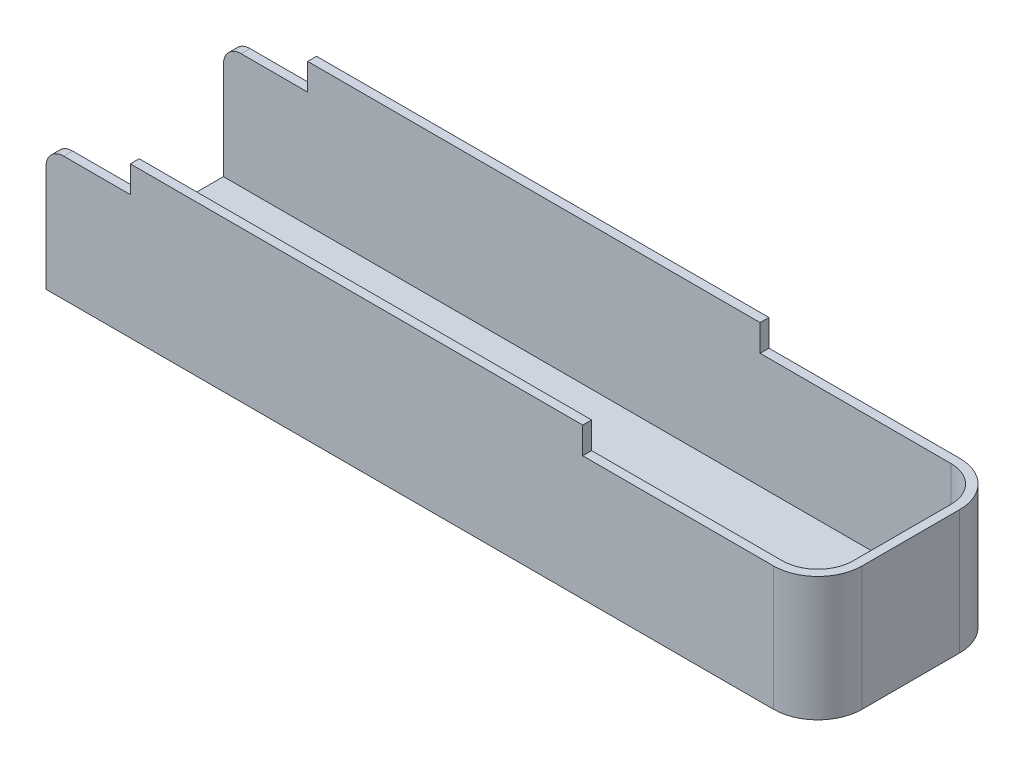
ISO-10303-21;
HEADER;
FILE_DESCRIPTION(('STEP AP214'),'2;1');
FILE_NAME('part.step','',(''),(''),'','','');
FILE_SCHEMA(('AUTOMOTIVE_DESIGN { 1 0 10303 214 1 1 1 1 }'));
ENDSEC;
DATA;
#1=APPLICATION_CONTEXT('core data for automotive mechanical design processes');
#2=APPLICATION_PROTOCOL_DEFINITION('international standard','automotive_design',2000,#1);
#3=PRODUCT_CONTEXT('',#1,'mechanical');
#4=PRODUCT('Part','Part','',(#3));
#5=PRODUCT_RELATED_PRODUCT_CATEGORY('part','',(#4));
#6=PRODUCT_DEFINITION_FORMATION('','',#4);
#7=PRODUCT_DEFINITION_CONTEXT('part definition',#1,'design');
#8=PRODUCT_DEFINITION('design','',#6,#7);
#9=PRODUCT_DEFINITION_SHAPE('','',#8);
#10=(LENGTH_UNIT() NAMED_UNIT(*) SI_UNIT(.MILLI.,.METRE.));
#11=(NAMED_UNIT(*) PLANE_ANGLE_UNIT() SI_UNIT($,.RADIAN.));
#12=(NAMED_UNIT(*) SI_UNIT($,.STERADIAN.) SOLID_ANGLE_UNIT());
#13=UNCERTAINTY_MEASURE_WITH_UNIT(LENGTH_MEASURE(1.E-05),#10,'distance_accuracy_value','');
#14=(GEOMETRIC_REPRESENTATION_CONTEXT(3) GLOBAL_UNCERTAINTY_ASSIGNED_CONTEXT((#13)) GLOBAL_UNIT_ASSIGNED_CONTEXT((#10,
#11,#12)) REPRESENTATION_CONTEXT('',''));
#15=CARTESIAN_POINT('',(0.,0.,0.));
#16=DIRECTION('',(0.,0.,1.));
#17=DIRECTION('',(1.,0.,0.));
#18=AXIS2_PLACEMENT_3D('',#15,#16,#17);
#19=CARTESIAN_POINT('',(38.4999999999949,17.,-5.50000000000137));
#20=DIRECTION('',(0.,1.,0.));
#21=DIRECTION('',(0.,0.,1.));
#22=AXIS2_PLACEMENT_3D('',#19,#20,#21);
#23=PLANE('',#22);
#24=DIRECTION('',(0.,0.,1.));
#25=VECTOR('',#24,1.);
#26=CARTESIAN_POINT('',(-33.9999999999959,16.999999999998,-15.4999999999986));
#27=LINE('',#26,#25);
#28=CARTESIAN_POINT('',(-33.9999999999959,16.999999999998,-10.5000000000014));
#29=VERTEX_POINT('',#28);
#30=CARTESIAN_POINT('',(-33.9999999999959,16.999999999998,-9.50000000000136));
#31=VERTEX_POINT('',#30);
#32=EDGE_CURVE('E205',#29,#31,#27,.T.);
#33=ORIENTED_EDGE('',*,*,#32,.T.);
#34=DIRECTION('',(-1.,0.,0.));
#35=VECTOR('',#34,1.);
#36=CARTESIAN_POINT('',(38.4999999999949,17.,-9.50000000000136));
#37=LINE('',#36,#35);
#38=CARTESIAN_POINT('',(16.999999999998,16.999999999998,-9.50000000000136));
#39=VERTEX_POINT('',#38);
#40=EDGE_CURVE('E272',#39,#31,#37,.T.);
#41=ORIENTED_EDGE('',*,*,#40,.F.);
#42=DIRECTION('',(0.,0.,1.));
#43=VECTOR('',#42,1.);
#44=CARTESIAN_POINT('',(16.999999999998,16.999999999998,-15.4999999999986));
#45=LINE('',#44,#43);
#46=CARTESIAN_POINT('',(16.999999999998,16.999999999998,-10.5000000000014));
#47=VERTEX_POINT('',#46);
#48=EDGE_CURVE('E225',#47,#39,#45,.T.);
#49=ORIENTED_EDGE('',*,*,#48,.F.);
#50=DIRECTION('',(-1.,0.,0.));
#51=VECTOR('',#50,1.);
#52=CARTESIAN_POINT('',(38.4999999999949,17.,-10.5000000000014));
#53=LINE('',#52,#51);
#54=EDGE_CURVE('E286',#47,#29,#53,.T.);
#55=ORIENTED_EDGE('',*,*,#54,.T.);
#56=EDGE_LOOP('',(#33,#41,#49,#55));
#57=FACE_BOUND('',#56,.T.);
#58=ADVANCED_FACE('F33',(#57),#23,.T.);
#59=CARTESIAN_POINT('',(-33.9999999999959,16.999999999998,9.50000000000136));
#60=VERTEX_POINT('',#59);
#61=CARTESIAN_POINT('',(-33.9999999999959,16.999999999998,10.5000000000014));
#62=VERTEX_POINT('',#61);
#63=EDGE_CURVE('E204',#60,#62,#27,.T.);
#64=ORIENTED_EDGE('',*,*,#63,.T.);
#65=DIRECTION('',(1.,0.,0.));
#66=VECTOR('',#65,1.);
#67=CARTESIAN_POINT('',(-43.4999999999949,17.,10.5000000000014));
#68=LINE('',#67,#66);
#69=CARTESIAN_POINT('',(16.999999999998,16.999999999998,10.5000000000014));
#70=VERTEX_POINT('',#69);
#71=EDGE_CURVE('E201',#62,#70,#68,.T.);
#72=ORIENTED_EDGE('',*,*,#71,.T.);
#73=CARTESIAN_POINT('',(16.999999999998,16.999999999998,9.50000000000136));
#74=VERTEX_POINT('',#73);
#75=EDGE_CURVE('E222',#74,#70,#45,.T.);
#76=ORIENTED_EDGE('',*,*,#75,.F.);
#77=DIRECTION('',(1.,0.,0.));
#78=VECTOR('',#77,1.);
#79=CARTESIAN_POINT('',(-42.4999999999949,17.,9.50000000000136));
#80=LINE('',#79,#78);
#81=EDGE_CURVE('E275',#60,#74,#80,.T.);
#82=ORIENTED_EDGE('',*,*,#81,.F.);
#83=EDGE_LOOP('',(#64,#72,#76,#82));
#84=FACE_BOUND('',#83,.T.);
#85=ADVANCED_FACE('F354',(#84),#23,.T.);
#86=CARTESIAN_POINT('',(38.4999999999949,0.,-5.50000000000137));
#87=DIRECTION('',(0.,1.,0.));
#88=DIRECTION('',(0.,0.,1.));
#89=AXIS2_PLACEMENT_3D('',#86,#87,#88);
#90=PLANE('',#89);
#91=CARTESIAN_POINT('',(38.4999999999949,0.,-5.50000000000137));
#92=DIRECTION('',(0.,1.,0.));
#93=DIRECTION('',(0.,0.,1.));
#94=AXIS2_PLACEMENT_3D('',#91,#92,#93);
#95=CIRCLE('',#94,5.);
#96=CARTESIAN_POINT('',(43.4999999999949,0.,-5.50000000000134));
#97=VERTEX_POINT('',#96);
#98=CARTESIAN_POINT('',(38.4999999999949,0.,-10.5000000000014));
#99=VERTEX_POINT('',#98);
#100=EDGE_CURVE('E285',#97,#99,#95,.T.);
#101=ORIENTED_EDGE('',*,*,#100,.F.);
#102=DIRECTION('',(0.,0.,-1.));
#103=VECTOR('',#102,1.);
#104=CARTESIAN_POINT('',(43.4999999999949,0.,5.50000000000133));
#105=LINE('',#104,#103);
#106=CARTESIAN_POINT('',(43.4999999999949,0.,5.50000000000133));
#107=VERTEX_POINT('',#106);
#108=EDGE_CURVE('E289',#107,#97,#105,.T.);
#109=ORIENTED_EDGE('',*,*,#108,.F.);
#110=CARTESIAN_POINT('',(38.4999999999949,0.,5.50000000000137));
#111=DIRECTION('',(0.,1.,0.));
#112=DIRECTION('',(0.,0.,1.));
#113=AXIS2_PLACEMENT_3D('',#110,#111,#112);
#114=CIRCLE('',#113,5.);
#115=CARTESIAN_POINT('',(38.4999999999949,0.,10.5000000000014));
#116=VERTEX_POINT('',#115);
#117=EDGE_CURVE('E303',#116,#107,#114,.T.);
#118=ORIENTED_EDGE('',*,*,#117,.F.);
#119=DIRECTION('',(1.,0.,0.));
#120=VECTOR('',#119,1.);
#121=CARTESIAN_POINT('',(-43.4999999999949,0.,10.5000000000014));
#122=LINE('',#121,#120);
#123=CARTESIAN_POINT('',(-43.4999999999949,0.,10.5000000000014));
#124=VERTEX_POINT('',#123);
#125=EDGE_CURVE('E300',#124,#116,#122,.T.);
#126=ORIENTED_EDGE('',*,*,#125,.F.);
#127=DIRECTION('',(0.,0.,1.));
#128=VECTOR('',#127,1.);
#129=CARTESIAN_POINT('',(-43.4999999999949,0.,-10.5000000000014));
#130=LINE('',#129,#128);
#131=CARTESIAN_POINT('',(-43.4999999999949,0.,-10.5000000000014));
#132=VERTEX_POINT('',#131);
#133=EDGE_CURVE('E297',#132,#124,#130,.T.);
#134=ORIENTED_EDGE('',*,*,#133,.F.);
#135=DIRECTION('',(-1.,0.,0.));
#136=VECTOR('',#135,1.);
#137=CARTESIAN_POINT('',(38.4999999999949,0.,-10.5000000000014));
#138=LINE('',#137,#136);
#139=EDGE_CURVE('E294',#99,#132,#138,.T.);
#140=ORIENTED_EDGE('',*,*,#139,.F.);
#141=EDGE_LOOP('',(#101,#109,#118,#126,#134,#140));
#142=FACE_BOUND('',#141,.T.);
#143=ADVANCED_FACE('F360',(#142),#90,.F.);
#144=CARTESIAN_POINT('',(38.4999999999949,17.,-5.50000000000137));
#145=DIRECTION('',(0.,-1.,0.));
#146=DIRECTION('',(0.,0.,-1.));
#147=AXIS2_PLACEMENT_3D('',#144,#145,#146);
#148=CYLINDRICAL_SURFACE('',#147,5.);
#149=DIRECTION('',(0.,-1.,0.));
#150=VECTOR('',#149,1.);
#151=CARTESIAN_POINT('',(38.4999999999949,17.,-10.5000000000014));
#152=LINE('',#151,#150);
#153=CARTESIAN_POINT('',(38.4999999999949,14.000000000005,-10.5000000000014));
#154=VERTEX_POINT('',#153);
#155=EDGE_CURVE('E317',#154,#99,#152,.T.);
#156=ORIENTED_EDGE('',*,*,#155,.F.);
#157=CARTESIAN_POINT('',(38.4999999999949,14.000000000005,-5.50000000000137));
#158=DIRECTION('',(0.,-1.,0.));
#159=DIRECTION('',(0.,0.,-1.));
#160=AXIS2_PLACEMENT_3D('',#157,#158,#159);
#161=CIRCLE('',#160,5.);
#162=CARTESIAN_POINT('',(43.4999999999947,14.000000000005,-5.50000000000134));
#163=VERTEX_POINT('',#162);
#164=EDGE_CURVE('E245',#154,#163,#161,.T.);
#165=ORIENTED_EDGE('',*,*,#164,.T.);
#166=DIRECTION('',(0.,-1.,0.));
#167=VECTOR('',#166,1.);
#168=CARTESIAN_POINT('',(43.4999999999949,17.,-5.50000000000134));
#169=LINE('',#168,#167);
#170=EDGE_CURVE('E291',#163,#97,#169,.T.);
#171=ORIENTED_EDGE('',*,*,#170,.T.);
#172=ORIENTED_EDGE('',*,*,#100,.T.);
#173=EDGE_LOOP('',(#156,#165,#171,#172));
#174=FACE_BOUND('',#173,.T.);
#175=ADVANCED_FACE('F369',(#174),#148,.T.);
#176=CARTESIAN_POINT('',(38.4999999999949,17.,-10.5000000000014));
#177=DIRECTION('',(0.,0.,1.));
#178=DIRECTION('',(1.,0.,0.));
#179=AXIS2_PLACEMENT_3D('',#176,#177,#178);
#180=PLANE('',#179);
#181=DIRECTION('',(0.,-1.,0.));
#182=VECTOR('',#181,1.);
#183=CARTESIAN_POINT('',(-43.4999999999949,17.,-10.5000000000014));
#184=LINE('',#183,#182);
#185=CARTESIAN_POINT('',(-43.4999999999949,12.0000000000075,-10.5000000000014));
#186=VERTEX_POINT('',#185);
#187=EDGE_CURVE('E315',#186,#132,#184,.T.);
#188=ORIENTED_EDGE('',*,*,#187,.F.);
#189=CARTESIAN_POINT('',(-41.4999999999949,12.0000000000075,-10.5000000000014));
#190=DIRECTION('',(0.,0.,1.));
#191=DIRECTION('',(1.,0.,0.));
#192=AXIS2_PLACEMENT_3D('',#189,#190,#191);
#193=CIRCLE('',#192,2.);
#194=CARTESIAN_POINT('',(-41.4999999999949,14.0000000000075,-10.5000000000014));
#195=VERTEX_POINT('',#194);
#196=EDGE_CURVE('E339',#186,#195,#193,.F.);
#197=ORIENTED_EDGE('',*,*,#196,.T.);
#198=DIRECTION('',(1.,0.,0.));
#199=VECTOR('',#198,1.);
#200=CARTESIAN_POINT('',(38.4999999999949,14.0000000000075,-10.5000000000014));
#201=LINE('',#200,#199);
#202=CARTESIAN_POINT('',(-33.9999999999959,14.0000000000075,-10.5000000000014));
#203=VERTEX_POINT('',#202);
#204=EDGE_CURVE('E209',#195,#203,#201,.T.);
#205=ORIENTED_EDGE('',*,*,#204,.T.);
#206=DIRECTION('',(0.,1.,0.));
#207=VECTOR('',#206,1.);
#208=CARTESIAN_POINT('',(-33.9999999999959,17.,-10.5000000000014));
#209=LINE('',#208,#207);
#210=EDGE_CURVE('E213',#203,#29,#209,.T.);
#211=ORIENTED_EDGE('',*,*,#210,.T.);
#212=ORIENTED_EDGE('',*,*,#54,.F.);
#213=DIRECTION('',(0.,-1.,0.));
#214=VECTOR('',#213,1.);
#215=CARTESIAN_POINT('',(16.999999999998,17.,-10.5000000000014));
#216=LINE('',#215,#214);
#217=CARTESIAN_POINT('',(16.999999999998,14.000000000005,-10.5000000000014));
#218=VERTEX_POINT('',#217);
#219=EDGE_CURVE('E250',#47,#218,#216,.T.);
#220=ORIENTED_EDGE('',*,*,#219,.T.);
#221=DIRECTION('',(1.,0.,0.));
#222=VECTOR('',#221,1.);
#223=CARTESIAN_POINT('',(38.4999999999949,14.000000000005,-10.5000000000014));
#224=LINE('',#223,#222);
#225=EDGE_CURVE('E242',#218,#154,#224,.T.);
#226=ORIENTED_EDGE('',*,*,#225,.T.);
#227=ORIENTED_EDGE('',*,*,#155,.T.);
#228=ORIENTED_EDGE('',*,*,#139,.T.);
#229=EDGE_LOOP('',(#188,#197,#205,#211,#212,#220,#226,#227,#228));
#230=FACE_BOUND('',#229,.T.);
#231=ADVANCED_FACE('F383',(#230),#180,.F.);
#232=CARTESIAN_POINT('',(-43.4999999999949,17.,-10.5000000000014));
#233=DIRECTION('',(1.,0.,0.));
#234=DIRECTION('',(0.,0.,-1.));
#235=AXIS2_PLACEMENT_3D('',#232,#233,#234);
#236=PLANE('',#235);
#237=DIRECTION('',(0.,1.,0.));
#238=VECTOR('',#237,1.);
#239=CARTESIAN_POINT('',(-43.4999999999949,17.,-9.50000000000136));
#240=LINE('',#239,#238);
#241=CARTESIAN_POINT('',(-43.4999999999949,0.999999999999994,-9.50000000000136));
#242=VERTEX_POINT('',#241);
#243=CARTESIAN_POINT('',(-43.4999999999949,12.0000000000075,-9.50000000000136));
#244=VERTEX_POINT('',#243);
#245=EDGE_CURVE('E253',#242,#244,#240,.T.);
#246=ORIENTED_EDGE('',*,*,#245,.T.);
#247=DIRECTION('',(0.,0.,1.));
#248=VECTOR('',#247,1.);
#249=CARTESIAN_POINT('',(-43.4999999999949,12.0000000000075,-10.5000000000014));
#250=LINE('',#249,#248);
#251=EDGE_CURVE('E337',#244,#186,#250,.F.);
#252=ORIENTED_EDGE('',*,*,#251,.T.);
#253=ORIENTED_EDGE('',*,*,#187,.T.);
#254=ORIENTED_EDGE('',*,*,#133,.T.);
#255=DIRECTION('',(0.,-1.,0.));
#256=VECTOR('',#255,1.);
#257=CARTESIAN_POINT('',(-43.4999999999949,17.,10.5000000000014));
#258=LINE('',#257,#256);
#259=CARTESIAN_POINT('',(-43.4999999999949,12.0000000000075,10.5000000000014));
#260=VERTEX_POINT('',#259);
#261=EDGE_CURVE('E313',#260,#124,#258,.T.);
#262=ORIENTED_EDGE('',*,*,#261,.F.);
#263=DIRECTION('',(0.,0.,1.));
#264=VECTOR('',#263,1.);
#265=CARTESIAN_POINT('',(-43.4999999999949,12.0000000000075,-10.5000000000014));
#266=LINE('',#265,#264);
#267=CARTESIAN_POINT('',(-43.4999999999949,12.0000000000075,9.50000000000136));
#268=VERTEX_POINT('',#267);
#269=EDGE_CURVE('E335',#260,#268,#266,.F.);
#270=ORIENTED_EDGE('',*,*,#269,.T.);
#271=DIRECTION('',(0.,-1.,0.));
#272=VECTOR('',#271,1.);
#273=CARTESIAN_POINT('',(-43.4999999999949,17.,9.50000000000136));
#274=LINE('',#273,#272);
#275=CARTESIAN_POINT('',(-43.4999999999949,0.999999999999994,9.50000000000136));
#276=VERTEX_POINT('',#275);
#277=EDGE_CURVE('E256',#268,#276,#274,.T.);
#278=ORIENTED_EDGE('',*,*,#277,.T.);
#279=DIRECTION('',(0.,0.,-1.));
#280=VECTOR('',#279,1.);
#281=CARTESIAN_POINT('',(-43.4999999999949,0.999999999999994,-10.5000000000014));
#282=LINE('',#281,#280);
#283=EDGE_CURVE('E258',#276,#242,#282,.T.);
#284=ORIENTED_EDGE('',*,*,#283,.T.);
#285=EDGE_LOOP('',(#246,#252,#253,#254,#262,#270,#278,#284));
#286=FACE_BOUND('',#285,.T.);
#287=ADVANCED_FACE('F343',(#286),#236,.F.);
#288=CARTESIAN_POINT('',(-43.4999999999949,17.,10.5000000000014));
#289=DIRECTION('',(0.,0.,-1.));
#290=DIRECTION('',(-1.,0.,0.));
#291=AXIS2_PLACEMENT_3D('',#288,#289,#290);
#292=PLANE('',#291);
#293=DIRECTION('',(1.,0.,0.));
#294=VECTOR('',#293,1.);
#295=CARTESIAN_POINT('',(-33.9999999999959,14.0000000000075,10.5000000000014));
#296=LINE('',#295,#294);
#297=CARTESIAN_POINT('',(-41.4999999999949,14.0000000000075,10.5000000000014));
#298=VERTEX_POINT('',#297);
#299=CARTESIAN_POINT('',(-33.9999999999959,14.0000000000075,10.5000000000014));
#300=VERTEX_POINT('',#299);
#301=EDGE_CURVE('E181',#298,#300,#296,.T.);
#302=ORIENTED_EDGE('',*,*,#301,.F.);
#303=CARTESIAN_POINT('',(-41.4999999999949,12.0000000000075,10.5000000000014));
#304=DIRECTION('',(0.,0.,-1.));
#305=DIRECTION('',(-1.,0.,0.));
#306=AXIS2_PLACEMENT_3D('',#303,#304,#305);
#307=CIRCLE('',#306,2.);
#308=EDGE_CURVE('E41',#298,#260,#307,.F.);
#309=ORIENTED_EDGE('',*,*,#308,.T.);
#310=ORIENTED_EDGE('',*,*,#261,.T.);
#311=ORIENTED_EDGE('',*,*,#125,.T.);
#312=DIRECTION('',(0.,-1.,0.));
#313=VECTOR('',#312,1.);
#314=CARTESIAN_POINT('',(38.4999999999949,17.,10.5000000000014));
#315=LINE('',#314,#313);
#316=CARTESIAN_POINT('',(38.4999999999949,14.000000000005,10.5000000000014));
#317=VERTEX_POINT('',#316);
#318=EDGE_CURVE('E311',#317,#116,#315,.T.);
#319=ORIENTED_EDGE('',*,*,#318,.F.);
#320=DIRECTION('',(1.,0.,0.));
#321=VECTOR('',#320,1.);
#322=CARTESIAN_POINT('',(43.4999999999947,14.000000000005,10.5000000000014));
#323=LINE('',#322,#321);
#324=CARTESIAN_POINT('',(16.999999999998,14.000000000005,10.5000000000014));
#325=VERTEX_POINT('',#324);
#326=EDGE_CURVE('E219',#325,#317,#323,.T.);
#327=ORIENTED_EDGE('',*,*,#326,.F.);
#328=DIRECTION('',(0.,-1.,0.));
#329=VECTOR('',#328,1.);
#330=CARTESIAN_POINT('',(16.999999999998,14.000000000005,10.5000000000014));
#331=LINE('',#330,#329);
#332=EDGE_CURVE('E216',#70,#325,#331,.T.);
#333=ORIENTED_EDGE('',*,*,#332,.F.);
#334=ORIENTED_EDGE('',*,*,#71,.F.);
#335=DIRECTION('',(0.,1.,0.));
#336=VECTOR('',#335,1.);
#337=CARTESIAN_POINT('',(-33.9999999999959,16.999999999998,10.5000000000014));
#338=LINE('',#337,#336);
#339=EDGE_CURVE('E189',#300,#62,#338,.T.);
#340=ORIENTED_EDGE('',*,*,#339,.F.);
#341=EDGE_LOOP('',(#302,#309,#310,#311,#319,#327,#333,#334,#340));
#342=FACE_BOUND('',#341,.T.);
#343=ADVANCED_FACE('F199',(#342),#292,.F.);
#344=CARTESIAN_POINT('',(38.4999999999949,17.,5.50000000000137));
#345=DIRECTION('',(0.,-1.,0.));
#346=DIRECTION('',(0.,0.,-1.));
#347=AXIS2_PLACEMENT_3D('',#344,#345,#346);
#348=CYLINDRICAL_SURFACE('',#347,5.);
#349=DIRECTION('',(0.,-1.,0.));
#350=VECTOR('',#349,1.);
#351=CARTESIAN_POINT('',(43.4999999999949,17.,5.50000000000133));
#352=LINE('',#351,#350);
#353=CARTESIAN_POINT('',(43.4999999999947,14.000000000005,5.50000000000133));
#354=VERTEX_POINT('',#353);
#355=EDGE_CURVE('E309',#354,#107,#352,.T.);
#356=ORIENTED_EDGE('',*,*,#355,.F.);
#357=CARTESIAN_POINT('',(38.4999999999949,14.000000000005,5.50000000000137));
#358=DIRECTION('',(0.,-1.,0.));
#359=DIRECTION('',(0.,0.,-1.));
#360=AXIS2_PLACEMENT_3D('',#357,#358,#359);
#361=CIRCLE('',#360,5.);
#362=EDGE_CURVE('E239',#354,#317,#361,.T.);
#363=ORIENTED_EDGE('',*,*,#362,.T.);
#364=ORIENTED_EDGE('',*,*,#318,.T.);
#365=ORIENTED_EDGE('',*,*,#117,.T.);
#366=EDGE_LOOP('',(#356,#363,#364,#365));
#367=FACE_BOUND('',#366,.T.);
#368=ADVANCED_FACE('F374',(#367),#348,.T.);
#369=CARTESIAN_POINT('',(43.4999999999949,17.,5.50000000000133));
#370=DIRECTION('',(-1.,0.,0.));
#371=DIRECTION('',(0.,0.,1.));
#372=AXIS2_PLACEMENT_3D('',#369,#370,#371);
#373=PLANE('',#372);
#374=ORIENTED_EDGE('',*,*,#170,.F.);
#375=DIRECTION('',(0.,0.,1.));
#376=VECTOR('',#375,1.);
#377=CARTESIAN_POINT('',(43.4999999999947,14.000000000005,-15.4999999999986));
#378=LINE('',#377,#376);
#379=EDGE_CURVE('E226',#163,#354,#378,.T.);
#380=ORIENTED_EDGE('',*,*,#379,.T.);
#381=ORIENTED_EDGE('',*,*,#355,.T.);
#382=ORIENTED_EDGE('',*,*,#108,.T.);
#383=EDGE_LOOP('',(#374,#380,#381,#382));
#384=FACE_BOUND('',#383,.T.);
#385=ADVANCED_FACE('F371',(#384),#373,.F.);
#386=CARTESIAN_POINT('',(38.4999999999949,17.,-9.50000000000136));
#387=DIRECTION('',(0.,0.,1.));
#388=DIRECTION('',(1.,0.,0.));
#389=AXIS2_PLACEMENT_3D('',#386,#387,#388);
#390=PLANE('',#389);
#391=DIRECTION('',(1.,0.,0.));
#392=VECTOR('',#391,1.);
#393=CARTESIAN_POINT('',(38.4999999999949,14.0000000000075,-9.50000000000136));
#394=LINE('',#393,#392);
#395=CARTESIAN_POINT('',(-41.4999999999949,14.0000000000075,-9.50000000000136));
#396=VERTEX_POINT('',#395);
#397=CARTESIAN_POINT('',(-33.9999999999959,14.0000000000075,-9.50000000000136));
#398=VERTEX_POINT('',#397);
#399=EDGE_CURVE('E207',#396,#398,#394,.T.);
#400=ORIENTED_EDGE('',*,*,#399,.F.);
#401=CARTESIAN_POINT('',(-41.4999999999949,12.0000000000075,-9.50000000000136));
#402=DIRECTION('',(0.,0.,1.));
#403=DIRECTION('',(1.,0.,0.));
#404=AXIS2_PLACEMENT_3D('',#401,#402,#403);
#405=CIRCLE('',#404,2.);
#406=EDGE_CURVE('E333',#396,#244,#405,.T.);
#407=ORIENTED_EDGE('',*,*,#406,.T.);
#408=ORIENTED_EDGE('',*,*,#245,.F.);
#409=DIRECTION('',(-1.,0.,0.));
#410=VECTOR('',#409,1.);
#411=CARTESIAN_POINT('',(38.4999999999949,1.,-9.50000000000136));
#412=LINE('',#411,#410);
#413=CARTESIAN_POINT('',(38.4999999999949,1.,-9.50000000000136));
#414=VERTEX_POINT('',#413);
#415=EDGE_CURVE('E270',#414,#242,#412,.T.);
#416=ORIENTED_EDGE('',*,*,#415,.F.);
#417=DIRECTION('',(0.,-1.,0.));
#418=VECTOR('',#417,1.);
#419=CARTESIAN_POINT('',(38.4999999999949,17.,-9.50000000000136));
#420=LINE('',#419,#418);
#421=CARTESIAN_POINT('',(38.4999999999949,14.000000000005,-9.50000000000136));
#422=VERTEX_POINT('',#421);
#423=EDGE_CURVE('E277',#422,#414,#420,.T.);
#424=ORIENTED_EDGE('',*,*,#423,.F.);
#425=DIRECTION('',(1.,0.,0.));
#426=VECTOR('',#425,1.);
#427=CARTESIAN_POINT('',(38.4999999999949,14.000000000005,-9.50000000000136));
#428=LINE('',#427,#426);
#429=CARTESIAN_POINT('',(16.999999999998,14.000000000005,-9.50000000000136));
#430=VERTEX_POINT('',#429);
#431=EDGE_CURVE('E237',#430,#422,#428,.T.);
#432=ORIENTED_EDGE('',*,*,#431,.F.);
#433=DIRECTION('',(0.,-1.,0.));
#434=VECTOR('',#433,1.);
#435=CARTESIAN_POINT('',(16.999999999998,17.,-9.50000000000136));
#436=LINE('',#435,#434);
#437=EDGE_CURVE('E248',#39,#430,#436,.T.);
#438=ORIENTED_EDGE('',*,*,#437,.F.);
#439=ORIENTED_EDGE('',*,*,#40,.T.);
#440=DIRECTION('',(0.,1.,0.));
#441=VECTOR('',#440,1.);
#442=CARTESIAN_POINT('',(-33.9999999999959,17.,-9.50000000000136));
#443=LINE('',#442,#441);
#444=EDGE_CURVE('E211',#398,#31,#443,.T.);
#445=ORIENTED_EDGE('',*,*,#444,.F.);
#446=EDGE_LOOP('',(#400,#407,#408,#416,#424,#432,#438,#439,#445));
#447=FACE_BOUND('',#446,.T.);
#448=ADVANCED_FACE('F365',(#447),#390,.T.);
#449=CARTESIAN_POINT('',(-42.4999999999949,17.,9.50000000000136));
#450=DIRECTION('',(0.,0.,-1.));
#451=DIRECTION('',(-1.,0.,0.));
#452=AXIS2_PLACEMENT_3D('',#449,#450,#451);
#453=PLANE('',#452);
#454=ORIENTED_EDGE('',*,*,#277,.F.);
#455=CARTESIAN_POINT('',(-41.4999999999949,12.0000000000075,9.50000000000136));
#456=DIRECTION('',(0.,0.,-1.));
#457=DIRECTION('',(-1.,0.,0.));
#458=AXIS2_PLACEMENT_3D('',#455,#456,#457);
#459=CIRCLE('',#458,2.);
#460=CARTESIAN_POINT('',(-41.4999999999949,14.0000000000075,9.50000000000136));
#461=VERTEX_POINT('',#460);
#462=EDGE_CURVE('E11',#268,#461,#459,.T.);
#463=ORIENTED_EDGE('',*,*,#462,.T.);
#464=DIRECTION('',(-1.,0.,0.));
#465=VECTOR('',#464,1.);
#466=CARTESIAN_POINT('',(-42.4999999999949,14.0000000000075,9.50000000000136));
#467=LINE('',#466,#465);
#468=CARTESIAN_POINT('',(-33.9999999999959,14.0000000000075,9.50000000000136));
#469=VERTEX_POINT('',#468);
#470=EDGE_CURVE('E327',#469,#461,#467,.T.);
#471=ORIENTED_EDGE('',*,*,#470,.F.);
#472=DIRECTION('',(0.,-1.,0.));
#473=VECTOR('',#472,1.);
#474=CARTESIAN_POINT('',(-33.9999999999959,17.,9.50000000000136));
#475=LINE('',#474,#473);
#476=EDGE_CURVE('E195',#60,#469,#475,.T.);
#477=ORIENTED_EDGE('',*,*,#476,.F.);
#478=ORIENTED_EDGE('',*,*,#81,.T.);
#479=DIRECTION('',(0.,1.,0.));
#480=VECTOR('',#479,1.);
#481=CARTESIAN_POINT('',(16.999999999998,17.,9.50000000000136));
#482=LINE('',#481,#480);
#483=CARTESIAN_POINT('',(16.999999999998,14.000000000005,9.50000000000136));
#484=VERTEX_POINT('',#483);
#485=EDGE_CURVE('E324',#484,#74,#482,.T.);
#486=ORIENTED_EDGE('',*,*,#485,.F.);
#487=DIRECTION('',(-1.,0.,0.));
#488=VECTOR('',#487,1.);
#489=CARTESIAN_POINT('',(-42.4999999999949,14.000000000005,9.50000000000136));
#490=LINE('',#489,#488);
#491=CARTESIAN_POINT('',(38.4999999999949,14.000000000005,9.50000000000136));
#492=VERTEX_POINT('',#491);
#493=EDGE_CURVE('E235',#492,#484,#490,.T.);
#494=ORIENTED_EDGE('',*,*,#493,.F.);
#495=DIRECTION('',(0.,-1.,0.));
#496=VECTOR('',#495,1.);
#497=CARTESIAN_POINT('',(38.4999999999949,17.,9.50000000000136));
#498=LINE('',#497,#496);
#499=CARTESIAN_POINT('',(38.4999999999949,1.,9.50000000000136));
#500=VERTEX_POINT('',#499);
#501=EDGE_CURVE('E283',#492,#500,#498,.T.);
#502=ORIENTED_EDGE('',*,*,#501,.T.);
#503=DIRECTION('',(1.,0.,0.));
#504=VECTOR('',#503,1.);
#505=CARTESIAN_POINT('',(-42.4999999999949,1.,9.50000000000136));
#506=LINE('',#505,#504);
#507=EDGE_CURVE('E267',#276,#500,#506,.T.);
#508=ORIENTED_EDGE('',*,*,#507,.F.);
#509=EDGE_LOOP('',(#454,#463,#471,#477,#478,#486,#494,#502,#508));
#510=FACE_BOUND('',#509,.T.);
#511=ADVANCED_FACE('F410',(#510),#453,.T.);
#512=CARTESIAN_POINT('',(38.4999999999949,17.,5.50000000000137));
#513=DIRECTION('',(0.,-1.,0.));
#514=DIRECTION('',(0.,0.,-1.));
#515=AXIS2_PLACEMENT_3D('',#512,#513,#514);
#516=CYLINDRICAL_SURFACE('',#515,4.);
#517=CARTESIAN_POINT('',(38.4999999999949,14.000000000005,5.50000000000137));
#518=DIRECTION('',(0.,-1.,0.));
#519=DIRECTION('',(0.,0.,-1.));
#520=AXIS2_PLACEMENT_3D('',#517,#518,#519);
#521=CIRCLE('',#520,4.);
#522=CARTESIAN_POINT('',(42.4999999999949,14.000000000005,5.50000000000134));
#523=VERTEX_POINT('',#522);
#524=EDGE_CURVE('E233',#523,#492,#521,.T.);
#525=ORIENTED_EDGE('',*,*,#524,.F.);
#526=DIRECTION('',(0.,-1.,0.));
#527=VECTOR('',#526,1.);
#528=CARTESIAN_POINT('',(42.4999999999949,17.,5.50000000000134));
#529=LINE('',#528,#527);
#530=CARTESIAN_POINT('',(42.4999999999949,1.,5.50000000000134));
#531=VERTEX_POINT('',#530);
#532=EDGE_CURVE('E281',#523,#531,#529,.T.);
#533=ORIENTED_EDGE('',*,*,#532,.T.);
#534=CARTESIAN_POINT('',(38.4999999999949,1.,5.50000000000137));
#535=DIRECTION('',(0.,1.,0.));
#536=DIRECTION('',(0.,0.,1.));
#537=AXIS2_PLACEMENT_3D('',#534,#535,#536);
#538=CIRCLE('',#537,4.);
#539=EDGE_CURVE('E264',#500,#531,#538,.T.);
#540=ORIENTED_EDGE('',*,*,#539,.F.);
#541=ORIENTED_EDGE('',*,*,#501,.F.);
#542=EDGE_LOOP('',(#525,#533,#540,#541));
#543=FACE_BOUND('',#542,.T.);
#544=ADVANCED_FACE('F416',(#543),#516,.F.);
#545=CARTESIAN_POINT('',(42.4999999999949,17.,5.50000000000134));
#546=DIRECTION('',(-1.,0.,0.));
#547=DIRECTION('',(0.,0.,1.));
#548=AXIS2_PLACEMENT_3D('',#545,#546,#547);
#549=PLANE('',#548);
#550=DIRECTION('',(0.,0.,1.));
#551=VECTOR('',#550,1.);
#552=CARTESIAN_POINT('',(42.4999999999949,14.000000000005,5.50000000000134));
#553=LINE('',#552,#551);
#554=CARTESIAN_POINT('',(42.4999999999949,14.000000000005,-5.50000000000134));
#555=VERTEX_POINT('',#554);
#556=EDGE_CURVE('E231',#555,#523,#553,.T.);
#557=ORIENTED_EDGE('',*,*,#556,.F.);
#558=DIRECTION('',(0.,-1.,0.));
#559=VECTOR('',#558,1.);
#560=CARTESIAN_POINT('',(42.4999999999949,17.,-5.50000000000134));
#561=LINE('',#560,#559);
#562=CARTESIAN_POINT('',(42.4999999999949,1.,-5.50000000000134));
#563=VERTEX_POINT('',#562);
#564=EDGE_CURVE('E279',#555,#563,#561,.T.);
#565=ORIENTED_EDGE('',*,*,#564,.T.);
#566=DIRECTION('',(0.,0.,-1.));
#567=VECTOR('',#566,1.);
#568=CARTESIAN_POINT('',(42.4999999999949,1.,5.50000000000134));
#569=LINE('',#568,#567);
#570=EDGE_CURVE('E261',#531,#563,#569,.T.);
#571=ORIENTED_EDGE('',*,*,#570,.F.);
#572=ORIENTED_EDGE('',*,*,#532,.F.);
#573=EDGE_LOOP('',(#557,#565,#571,#572));
#574=FACE_BOUND('',#573,.T.);
#575=ADVANCED_FACE('F454',(#574),#549,.T.);
#576=CARTESIAN_POINT('',(38.4999999999949,17.,-5.50000000000137));
#577=DIRECTION('',(0.,-1.,0.));
#578=DIRECTION('',(0.,0.,-1.));
#579=AXIS2_PLACEMENT_3D('',#576,#577,#578);
#580=CYLINDRICAL_SURFACE('',#579,4.);
#581=CARTESIAN_POINT('',(38.4999999999949,14.000000000005,-5.50000000000137));
#582=DIRECTION('',(0.,-1.,0.));
#583=DIRECTION('',(0.,0.,-1.));
#584=AXIS2_PLACEMENT_3D('',#581,#582,#583);
#585=CIRCLE('',#584,4.);
#586=EDGE_CURVE('E322',#422,#555,#585,.T.);
#587=ORIENTED_EDGE('',*,*,#586,.F.);
#588=ORIENTED_EDGE('',*,*,#423,.T.);
#589=CARTESIAN_POINT('',(38.4999999999949,1.,-5.50000000000137));
#590=DIRECTION('',(0.,1.,0.));
#591=DIRECTION('',(0.,0.,1.));
#592=AXIS2_PLACEMENT_3D('',#589,#590,#591);
#593=CIRCLE('',#592,4.);
#594=EDGE_CURVE('E319',#563,#414,#593,.T.);
#595=ORIENTED_EDGE('',*,*,#594,.F.);
#596=ORIENTED_EDGE('',*,*,#564,.F.);
#597=EDGE_LOOP('',(#587,#588,#595,#596));
#598=FACE_BOUND('',#597,.T.);
#599=ADVANCED_FACE('F450',(#598),#580,.F.);
#600=CARTESIAN_POINT('',(38.4999999999949,1.,5.50000000000138));
#601=DIRECTION('',(0.,1.,0.));
#602=DIRECTION('',(0.,0.,1.));
#603=AXIS2_PLACEMENT_3D('',#600,#601,#602);
#604=PLANE('',#603);
#605=ORIENTED_EDGE('',*,*,#415,.T.);
#606=ORIENTED_EDGE('',*,*,#283,.F.);
#607=ORIENTED_EDGE('',*,*,#507,.T.);
#608=ORIENTED_EDGE('',*,*,#539,.T.);
#609=ORIENTED_EDGE('',*,*,#570,.T.);
#610=ORIENTED_EDGE('',*,*,#594,.T.);
#611=EDGE_LOOP('',(#605,#606,#607,#608,#609,#610));
#612=FACE_BOUND('',#611,.T.);
#613=ADVANCED_FACE('F420',(#612),#604,.T.);
#614=CARTESIAN_POINT('',(16.999999999998,14.000000000005,-15.4999999999986));
#615=DIRECTION('',(-1.,0.,0.));
#616=DIRECTION('',(0.,0.,1.));
#617=AXIS2_PLACEMENT_3D('',#614,#615,#616);
#618=PLANE('',#617);
#619=ORIENTED_EDGE('',*,*,#48,.T.);
#620=ORIENTED_EDGE('',*,*,#437,.T.);
#621=DIRECTION('',(0.,0.,1.));
#622=VECTOR('',#621,1.);
#623=CARTESIAN_POINT('',(16.999999999998,14.000000000005,-15.4999999999986));
#624=LINE('',#623,#622);
#625=EDGE_CURVE('E229',#218,#430,#624,.T.);
#626=ORIENTED_EDGE('',*,*,#625,.F.);
#627=ORIENTED_EDGE('',*,*,#219,.F.);
#628=EDGE_LOOP('',(#619,#620,#626,#627));
#629=FACE_BOUND('',#628,.T.);
#630=ADVANCED_FACE('F444',(#629),#618,.F.);
#631=CARTESIAN_POINT('',(43.4999999999947,14.000000000005,-15.4999999999986));
#632=DIRECTION('',(0.,-1.,0.));
#633=DIRECTION('',(0.,0.,-1.));
#634=AXIS2_PLACEMENT_3D('',#631,#632,#633);
#635=PLANE('',#634);
#636=ORIENTED_EDGE('',*,*,#225,.F.);
#637=ORIENTED_EDGE('',*,*,#625,.T.);
#638=ORIENTED_EDGE('',*,*,#431,.T.);
#639=ORIENTED_EDGE('',*,*,#586,.T.);
#640=ORIENTED_EDGE('',*,*,#556,.T.);
#641=ORIENTED_EDGE('',*,*,#524,.T.);
#642=ORIENTED_EDGE('',*,*,#493,.T.);
#643=EDGE_CURVE('E221',#484,#325,#624,.T.);
#644=ORIENTED_EDGE('',*,*,#643,.T.);
#645=ORIENTED_EDGE('',*,*,#326,.T.);
#646=ORIENTED_EDGE('',*,*,#362,.F.);
#647=ORIENTED_EDGE('',*,*,#379,.F.);
#648=ORIENTED_EDGE('',*,*,#164,.F.);
#649=EDGE_LOOP('',(#636,#637,#638,#639,#640,#641,#642,#644,#645,#646,#647,#648));
#650=FACE_BOUND('',#649,.T.);
#651=ADVANCED_FACE('F402',(#650),#635,.F.);
#652=ORIENTED_EDGE('',*,*,#485,.T.);
#653=ORIENTED_EDGE('',*,*,#75,.T.);
#654=ORIENTED_EDGE('',*,*,#332,.T.);
#655=ORIENTED_EDGE('',*,*,#643,.F.);
#656=EDGE_LOOP('',(#652,#653,#654,#655));
#657=FACE_BOUND('',#656,.T.);
#658=ADVANCED_FACE('F407',(#657),#618,.F.);
#659=CARTESIAN_POINT('',(-33.9999999999959,14.0000000000075,-15.4999999999986));
#660=DIRECTION('',(0.,-1.,0.));
#661=DIRECTION('',(0.,0.,-1.));
#662=AXIS2_PLACEMENT_3D('',#659,#660,#661);
#663=PLANE('',#662);
#664=ORIENTED_EDGE('',*,*,#470,.T.);
#665=DIRECTION('',(0.,0.,1.));
#666=VECTOR('',#665,1.);
#667=CARTESIAN_POINT('',(-41.4999999999949,14.0000000000075,-15.4999999999986));
#668=LINE('',#667,#666);
#669=EDGE_CURVE('E186',#461,#298,#668,.T.);
#670=ORIENTED_EDGE('',*,*,#669,.T.);
#671=ORIENTED_EDGE('',*,*,#301,.T.);
#672=DIRECTION('',(0.,0.,1.));
#673=VECTOR('',#672,1.);
#674=CARTESIAN_POINT('',(-33.9999999999959,14.0000000000075,-15.4999999999986));
#675=LINE('',#674,#673);
#676=EDGE_CURVE('E184',#469,#300,#675,.T.);
#677=ORIENTED_EDGE('',*,*,#676,.F.);
#678=EDGE_LOOP('',(#664,#670,#671,#677));
#679=FACE_BOUND('',#678,.T.);
#680=ADVANCED_FACE('F183',(#679),#663,.F.);
#681=CARTESIAN_POINT('',(-33.9999999999959,16.999999999998,-15.4999999999986));
#682=DIRECTION('',(1.,0.,0.));
#683=DIRECTION('',(0.,0.,-1.));
#684=AXIS2_PLACEMENT_3D('',#681,#682,#683);
#685=PLANE('',#684);
#686=ORIENTED_EDGE('',*,*,#476,.T.);
#687=ORIENTED_EDGE('',*,*,#676,.T.);
#688=ORIENTED_EDGE('',*,*,#339,.T.);
#689=ORIENTED_EDGE('',*,*,#63,.F.);
#690=EDGE_LOOP('',(#686,#687,#688,#689));
#691=FACE_BOUND('',#690,.T.);
#692=ADVANCED_FACE('F192',(#691),#685,.F.);
#693=EDGE_CURVE('E196',#203,#398,#675,.T.);
#694=ORIENTED_EDGE('',*,*,#693,.T.);
#695=ORIENTED_EDGE('',*,*,#444,.T.);
#696=ORIENTED_EDGE('',*,*,#32,.F.);
#697=ORIENTED_EDGE('',*,*,#210,.F.);
#698=EDGE_LOOP('',(#694,#695,#696,#697));
#699=FACE_BOUND('',#698,.T.);
#700=ADVANCED_FACE('F436',(#699),#685,.F.);
#701=ORIENTED_EDGE('',*,*,#204,.F.);
#702=DIRECTION('',(0.,0.,1.));
#703=VECTOR('',#702,1.);
#704=CARTESIAN_POINT('',(-41.4999999999949,14.0000000000075,-15.4999999999986));
#705=LINE('',#704,#703);
#706=EDGE_CURVE('E330',#195,#396,#705,.T.);
#707=ORIENTED_EDGE('',*,*,#706,.T.);
#708=ORIENTED_EDGE('',*,*,#399,.T.);
#709=ORIENTED_EDGE('',*,*,#693,.F.);
#710=EDGE_LOOP('',(#701,#707,#708,#709));
#711=FACE_BOUND('',#710,.T.);
#712=ADVANCED_FACE('F351',(#711),#663,.F.);
#713=CARTESIAN_POINT('',(-41.4999999999949,12.0000000000075,-15.4999999999986));
#714=DIRECTION('',(0.,0.,1.));
#715=DIRECTION('',(1.,0.,0.));
#716=AXIS2_PLACEMENT_3D('',#713,#714,#715);
#717=CYLINDRICAL_SURFACE('',#716,2.);
#718=ORIENTED_EDGE('',*,*,#196,.F.);
#719=ORIENTED_EDGE('',*,*,#251,.F.);
#720=ORIENTED_EDGE('',*,*,#406,.F.);
#721=ORIENTED_EDGE('',*,*,#706,.F.);
#722=EDGE_LOOP('',(#718,#719,#720,#721));
#723=FACE_BOUND('',#722,.T.);
#724=ADVANCED_FACE('F347',(#723),#717,.T.);
#725=CARTESIAN_POINT('',(-41.4999999999949,12.0000000000075,-15.4999999999986));
#726=DIRECTION('',(0.,0.,1.));
#727=DIRECTION('',(1.,0.,0.));
#728=AXIS2_PLACEMENT_3D('',#725,#726,#727);
#729=CYLINDRICAL_SURFACE('',#728,2.);
#730=ORIENTED_EDGE('',*,*,#462,.F.);
#731=ORIENTED_EDGE('',*,*,#269,.F.);
#732=ORIENTED_EDGE('',*,*,#308,.F.);
#733=ORIENTED_EDGE('',*,*,#669,.F.);
#734=EDGE_LOOP('',(#730,#731,#732,#733));
#735=FACE_BOUND('',#734,.T.);
#736=ADVANCED_FACE('F35',(#735),#729,.T.);
#737=CLOSED_SHELL('',(#58,#85,#143,#175,#231,#287,#343,#368,#385,#448,#511,#544,#575,#599,#613,
#630,#651,#658,#680,#692,#700,#712,#724,#736));
#738=MANIFOLD_SOLID_BREP('B2',#737);
#739=ADVANCED_BREP_SHAPE_REPRESENTATION('',(#18,#738),#14);
#740=SHAPE_DEFINITION_REPRESENTATION(#9,#739);
ENDSEC;
END-ISO-10303-21;
